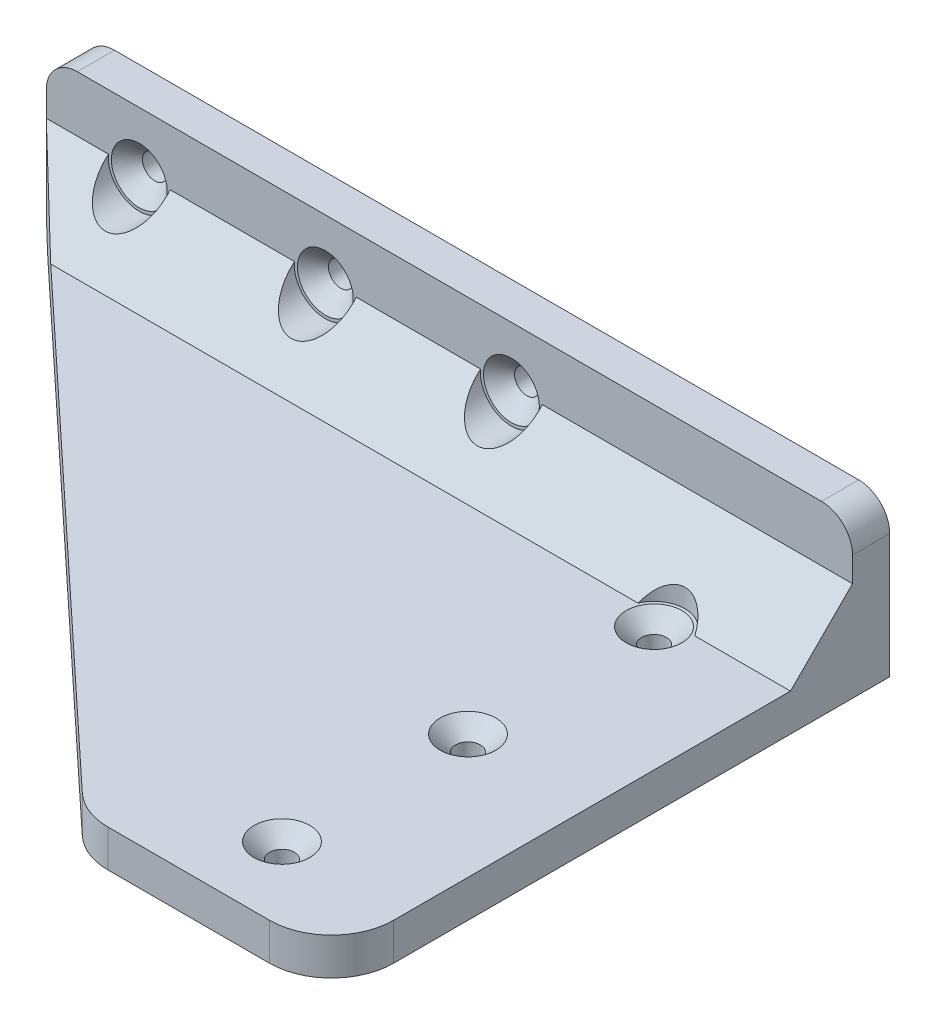
ISO-10303-21;
HEADER;
FILE_DESCRIPTION(('STEP AP214'),'2;1');
FILE_NAME('part.step','',(''),(''),'','','');
FILE_SCHEMA(('AUTOMOTIVE_DESIGN { 1 0 10303 214 1 1 1 1 }'));
ENDSEC;
DATA;
#1=APPLICATION_CONTEXT('core data for automotive mechanical design processes');
#2=APPLICATION_PROTOCOL_DEFINITION('international standard','automotive_design',2000,#1);
#3=PRODUCT_CONTEXT('',#1,'mechanical');
#4=PRODUCT('Part','Part','',(#3));
#5=PRODUCT_RELATED_PRODUCT_CATEGORY('part','',(#4));
#6=PRODUCT_DEFINITION_FORMATION('','',#4);
#7=PRODUCT_DEFINITION_CONTEXT('part definition',#1,'design');
#8=PRODUCT_DEFINITION('design','',#6,#7);
#9=PRODUCT_DEFINITION_SHAPE('','',#8);
#10=(LENGTH_UNIT() NAMED_UNIT(*) SI_UNIT(.MILLI.,.METRE.));
#11=(NAMED_UNIT(*) PLANE_ANGLE_UNIT() SI_UNIT($,.RADIAN.));
#12=(NAMED_UNIT(*) SI_UNIT($,.STERADIAN.) SOLID_ANGLE_UNIT());
#13=UNCERTAINTY_MEASURE_WITH_UNIT(LENGTH_MEASURE(1.E-05),#10,'distance_accuracy_value','');
#14=(GEOMETRIC_REPRESENTATION_CONTEXT(3) GLOBAL_UNCERTAINTY_ASSIGNED_CONTEXT((#13)) GLOBAL_UNIT_ASSIGNED_CONTEXT((#10,
#11,#12)) REPRESENTATION_CONTEXT('',''));
#15=CARTESIAN_POINT('',(0.,0.,0.));
#16=DIRECTION('',(0.,0.,1.));
#17=DIRECTION('',(1.,0.,0.));
#18=AXIS2_PLACEMENT_3D('',#15,#16,#17);
#19=CARTESIAN_POINT('',(0.,16.,6.));
#20=DIRECTION('',(0.,0.707106781186544,0.707106781186551));
#21=DIRECTION('',(-1.,0.,0.));
#22=AXIS2_PLACEMENT_3D('',#19,#20,#21);
#23=PLANE('',#22);
#24=CARTESIAN_POINT('',(110.,3.99999999999992,18.));
#25=DIRECTION('',(0.,0.707106781186544,0.707106781186551));
#26=DIRECTION('',(0.,-0.707106781186551,0.707106781186544));
#27=AXIS2_PLACEMENT_3D('',#24,#25,#26);
#28=ELLIPSE('',#27,7.07106781186552,5.);
#29=CARTESIAN_POINT('',(114.582575694956,6.,15.9999999999999));
#30=VERTEX_POINT('',#29);
#31=CARTESIAN_POINT('',(105.417424305044,6.,15.9999999999999));
#32=VERTEX_POINT('',#31);
#33=EDGE_CURVE('E152',#30,#32,#28,.T.);
#34=ORIENTED_EDGE('',*,*,#33,.F.);
#35=DIRECTION('',(-1.,0.,0.));
#36=VECTOR('',#35,1.);
#37=CARTESIAN_POINT('',(0.,6.,15.9999999999999));
#38=LINE('',#37,#36);
#39=CARTESIAN_POINT('',(130.,6.,16.));
#40=VERTEX_POINT('',#39);
#41=EDGE_CURVE('E161',#40,#30,#38,.T.);
#42=ORIENTED_EDGE('',*,*,#41,.F.);
#43=DIRECTION('',(0.,0.707106781186551,-0.707106781186544));
#44=VECTOR('',#43,1.);
#45=CARTESIAN_POINT('',(130.,10.9999999999999,11.));
#46=LINE('',#45,#44);
#47=CARTESIAN_POINT('',(130.,16.,6.));
#48=VERTEX_POINT('',#47);
#49=EDGE_CURVE('E171',#48,#40,#46,.F.);
#50=ORIENTED_EDGE('',*,*,#49,.F.);
#51=DIRECTION('',(1.,0.,0.));
#52=VECTOR('',#51,1.);
#53=CARTESIAN_POINT('',(130.,16.,6.));
#54=LINE('',#53,#52);
#55=CARTESIAN_POINT('',(79.9749371855331,16.,6.));
#56=VERTEX_POINT('',#55);
#57=EDGE_CURVE('E287',#56,#48,#54,.T.);
#58=ORIENTED_EDGE('',*,*,#57,.F.);
#59=CARTESIAN_POINT('',(75.,15.5,6.50000000000003));
#60=DIRECTION('',(0.,0.707106781186544,0.707106781186551));
#61=DIRECTION('',(0.,0.707106781186551,-0.707106781186544));
#62=AXIS2_PLACEMENT_3D('',#59,#60,#61);
#63=ELLIPSE('',#62,7.07106781186545,5.);
#64=CARTESIAN_POINT('',(70.0250628144669,16.,6.));
#65=VERTEX_POINT('',#64);
#66=EDGE_CURVE('E303',#65,#56,#63,.T.);
#67=ORIENTED_EDGE('',*,*,#66,.F.);
#68=DIRECTION('',(1.,0.,0.));
#69=VECTOR('',#68,1.);
#70=CARTESIAN_POINT('',(130.,16.,6.));
#71=LINE('',#70,#69);
#72=CARTESIAN_POINT('',(49.9749371855331,16.,6.));
#73=VERTEX_POINT('',#72);
#74=EDGE_CURVE('E290',#73,#65,#71,.T.);
#75=ORIENTED_EDGE('',*,*,#74,.F.);
#76=CARTESIAN_POINT('',(45.,15.5,6.50000000000003));
#77=DIRECTION('',(0.,0.707106781186544,0.707106781186551));
#78=DIRECTION('',(0.,0.707106781186551,-0.707106781186544));
#79=AXIS2_PLACEMENT_3D('',#76,#77,#78);
#80=ELLIPSE('',#79,7.07106781186544,5.);
#81=CARTESIAN_POINT('',(40.0250628144669,16.,6.));
#82=VERTEX_POINT('',#81);
#83=EDGE_CURVE('E181',#82,#73,#80,.T.);
#84=ORIENTED_EDGE('',*,*,#83,.F.);
#85=DIRECTION('',(1.,0.,0.));
#86=VECTOR('',#85,1.);
#87=CARTESIAN_POINT('',(130.,16.,6.));
#88=LINE('',#87,#86);
#89=CARTESIAN_POINT('',(19.9749371855331,16.,6.));
#90=VERTEX_POINT('',#89);
#91=EDGE_CURVE('E293',#90,#82,#88,.T.);
#92=ORIENTED_EDGE('',*,*,#91,.F.);
#93=CARTESIAN_POINT('',(15.,15.5,6.50000000000003));
#94=DIRECTION('',(0.,0.707106781186544,0.707106781186551));
#95=DIRECTION('',(0.,0.707106781186551,-0.707106781186544));
#96=AXIS2_PLACEMENT_3D('',#93,#94,#95);
#97=ELLIPSE('',#96,7.07106781186544,5.);
#98=CARTESIAN_POINT('',(10.0250628144669,16.,6.));
#99=VERTEX_POINT('',#98);
#100=EDGE_CURVE('E299',#99,#90,#97,.T.);
#101=ORIENTED_EDGE('',*,*,#100,.F.);
#102=DIRECTION('',(1.,0.,0.));
#103=VECTOR('',#102,1.);
#104=CARTESIAN_POINT('',(130.,16.,6.));
#105=LINE('',#104,#103);
#106=CARTESIAN_POINT('',(0.,16.,6.));
#107=VERTEX_POINT('',#106);
#108=EDGE_CURVE('E175',#107,#99,#105,.T.);
#109=ORIENTED_EDGE('',*,*,#108,.F.);
#110=DIRECTION('',(0.603877261671354,-0.563618777559936,0.56361877755993));
#111=VECTOR('',#110,1.);
#112=CARTESIAN_POINT('',(0.,16.,6.));
#113=LINE('',#112,#111);
#114=CARTESIAN_POINT('',(10.7142857142856,6.,15.9999999999999));
#115=VERTEX_POINT('',#114);
#116=EDGE_CURVE('E173',#115,#107,#113,.F.);
#117=ORIENTED_EDGE('',*,*,#116,.F.);
#118=DIRECTION('',(-1.,0.,0.));
#119=VECTOR('',#118,1.);
#120=CARTESIAN_POINT('',(0.,6.,15.9999999999999));
#121=LINE('',#120,#119);
#122=EDGE_CURVE('E163',#32,#115,#121,.T.);
#123=ORIENTED_EDGE('',*,*,#122,.F.);
#124=EDGE_LOOP('',(#34,#42,#50,#58,#67,#75,#84,#92,#101,#109,#117,#123));
#125=FACE_BOUND('',#124,.T.);
#126=ADVANCED_FACE('F32',(#125),#23,.T.);
#127=CARTESIAN_POINT('',(75.,15.5,0.));
#128=DIRECTION('',(0.,0.,1.));
#129=DIRECTION('',(1.,0.,0.));
#130=AXIS2_PLACEMENT_3D('',#127,#128,#129);
#131=CYLINDRICAL_SURFACE('',#130,2.);
#132=CARTESIAN_POINT('',(75.,15.5,3.49999999999994));
#133=DIRECTION('',(0.,0.,-1.));
#134=DIRECTION('',(-1.,0.,0.));
#135=AXIS2_PLACEMENT_3D('',#132,#133,#134);
#136=CIRCLE('',#135,2.);
#137=CARTESIAN_POINT('',(73.,15.5,3.49999999999994));
#138=VERTEX_POINT('',#137);
#139=EDGE_CURVE('E201',#138,#138,#136,.F.);
#140=ORIENTED_EDGE('',*,*,#139,.T.);
#141=EDGE_LOOP('',(#140));
#142=FACE_BOUND('',#141,.T.);
#143=CARTESIAN_POINT('',(75.,15.5,0.));
#144=DIRECTION('',(0.,0.,1.));
#145=DIRECTION('',(-1.,0.,0.));
#146=AXIS2_PLACEMENT_3D('',#143,#144,#145);
#147=CIRCLE('',#146,2.);
#148=CARTESIAN_POINT('',(73.,15.5,0.));
#149=VERTEX_POINT('',#148);
#150=EDGE_CURVE('E319',#149,#149,#147,.T.);
#151=ORIENTED_EDGE('',*,*,#150,.F.);
#152=EDGE_LOOP('',(#151));
#153=FACE_BOUND('',#152,.T.);
#154=ADVANCED_FACE('F383',(#142,#153),#131,.F.);
#155=CARTESIAN_POINT('',(15.,15.5,0.));
#156=DIRECTION('',(0.,0.,1.));
#157=DIRECTION('',(1.,0.,0.));
#158=AXIS2_PLACEMENT_3D('',#155,#156,#157);
#159=CYLINDRICAL_SURFACE('',#158,2.);
#160=CARTESIAN_POINT('',(15.,15.5,3.49999999999998));
#161=DIRECTION('',(0.,0.,-1.));
#162=DIRECTION('',(-1.,0.,0.));
#163=AXIS2_PLACEMENT_3D('',#160,#161,#162);
#164=CIRCLE('',#163,2.);
#165=CARTESIAN_POINT('',(13.,15.5,3.49999999999998));
#166=VERTEX_POINT('',#165);
#167=EDGE_CURVE('E216',#166,#166,#164,.F.);
#168=ORIENTED_EDGE('',*,*,#167,.T.);
#169=EDGE_LOOP('',(#168));
#170=FACE_BOUND('',#169,.T.);
#171=CARTESIAN_POINT('',(15.,15.5,0.));
#172=DIRECTION('',(0.,0.,1.));
#173=DIRECTION('',(1.,0.,0.));
#174=AXIS2_PLACEMENT_3D('',#171,#172,#173);
#175=CIRCLE('',#174,2.);
#176=CARTESIAN_POINT('',(17.,15.5,0.));
#177=VERTEX_POINT('',#176);
#178=EDGE_CURVE('E320',#177,#177,#175,.T.);
#179=ORIENTED_EDGE('',*,*,#178,.F.);
#180=EDGE_LOOP('',(#179));
#181=FACE_BOUND('',#180,.T.);
#182=ADVANCED_FACE('F388',(#170,#181),#159,.F.);
#183=CARTESIAN_POINT('',(45.,15.5,0.));
#184=DIRECTION('',(0.,0.,1.));
#185=DIRECTION('',(1.,0.,0.));
#186=AXIS2_PLACEMENT_3D('',#183,#184,#185);
#187=CYLINDRICAL_SURFACE('',#186,2.);
#188=CARTESIAN_POINT('',(45.,15.5,3.49999999999998));
#189=DIRECTION('',(0.,0.,-1.));
#190=DIRECTION('',(-1.,0.,0.));
#191=AXIS2_PLACEMENT_3D('',#188,#189,#190);
#192=CIRCLE('',#191,2.);
#193=CARTESIAN_POINT('',(43.,15.5,3.49999999999998));
#194=VERTEX_POINT('',#193);
#195=EDGE_CURVE('E213',#194,#194,#192,.F.);
#196=ORIENTED_EDGE('',*,*,#195,.T.);
#197=EDGE_LOOP('',(#196));
#198=FACE_BOUND('',#197,.T.);
#199=CARTESIAN_POINT('',(45.,15.5,0.));
#200=DIRECTION('',(0.,0.,1.));
#201=DIRECTION('',(1.,0.,0.));
#202=AXIS2_PLACEMENT_3D('',#199,#200,#201);
#203=CIRCLE('',#202,2.);
#204=CARTESIAN_POINT('',(47.,15.5,0.));
#205=VERTEX_POINT('',#204);
#206=EDGE_CURVE('E323',#205,#205,#203,.T.);
#207=ORIENTED_EDGE('',*,*,#206,.F.);
#208=EDGE_LOOP('',(#207));
#209=FACE_BOUND('',#208,.T.);
#210=ADVANCED_FACE('F542',(#198,#209),#187,.F.);
#211=CARTESIAN_POINT('',(0.,0.,6.));
#212=DIRECTION('',(0.,0.,-1.));
#213=DIRECTION('',(-1.,0.,0.));
#214=AXIS2_PLACEMENT_3D('',#211,#212,#213);
#215=PLANE('',#214);
#216=CARTESIAN_POINT('',(75.,15.5,6.));
#217=DIRECTION('',(0.,0.,-1.));
#218=DIRECTION('',(-1.,0.,0.));
#219=AXIS2_PLACEMENT_3D('',#216,#217,#218);
#220=CIRCLE('',#219,4.50000000000007);
#221=CARTESIAN_POINT('',(70.4999999999999,15.5,6.));
#222=VERTEX_POINT('',#221);
#223=EDGE_CURVE('E210',#222,#222,#220,.T.);
#224=ORIENTED_EDGE('',*,*,#223,.T.);
#225=EDGE_LOOP('',(#224));
#226=FACE_BOUND('',#225,.T.);
#227=CARTESIAN_POINT('',(45.,15.5,6.));
#228=DIRECTION('',(0.,0.,-1.));
#229=DIRECTION('',(-1.,0.,0.));
#230=AXIS2_PLACEMENT_3D('',#227,#228,#229);
#231=CIRCLE('',#230,4.50000000000003);
#232=CARTESIAN_POINT('',(40.5,15.5,6.));
#233=VERTEX_POINT('',#232);
#234=EDGE_CURVE('E207',#233,#233,#231,.T.);
#235=ORIENTED_EDGE('',*,*,#234,.T.);
#236=EDGE_LOOP('',(#235));
#237=FACE_BOUND('',#236,.T.);
#238=CARTESIAN_POINT('',(15.,15.5,6.));
#239=DIRECTION('',(0.,0.,-1.));
#240=DIRECTION('',(-1.,0.,0.));
#241=AXIS2_PLACEMENT_3D('',#238,#239,#240);
#242=CIRCLE('',#241,4.50000000000003);
#243=CARTESIAN_POINT('',(10.5,15.5,6.));
#244=VERTEX_POINT('',#243);
#245=EDGE_CURVE('E204',#244,#244,#242,.T.);
#246=ORIENTED_EDGE('',*,*,#245,.T.);
#247=EDGE_LOOP('',(#246));
#248=FACE_BOUND('',#247,.T.);
#249=DIRECTION('',(-1.,0.,0.));
#250=VECTOR('',#249,1.);
#251=CARTESIAN_POINT('',(0.,25.,6.));
#252=LINE('',#251,#250);
#253=CARTESIAN_POINT('',(125.,25.,6.));
#254=VERTEX_POINT('',#253);
#255=CARTESIAN_POINT('',(5.,25.,6.));
#256=VERTEX_POINT('',#255);
#257=EDGE_CURVE('E263',#254,#256,#252,.T.);
#258=ORIENTED_EDGE('',*,*,#257,.T.);
#259=CARTESIAN_POINT('',(5.,20.,6.));
#260=DIRECTION('',(0.,0.,-1.));
#261=DIRECTION('',(-1.,0.,0.));
#262=AXIS2_PLACEMENT_3D('',#259,#260,#261);
#263=CIRCLE('',#262,5.);
#264=CARTESIAN_POINT('',(0.,20.,6.));
#265=VERTEX_POINT('',#264);
#266=EDGE_CURVE('E40',#256,#265,#263,.F.);
#267=ORIENTED_EDGE('',*,*,#266,.T.);
#268=DIRECTION('',(0.,-1.,0.));
#269=VECTOR('',#268,1.);
#270=CARTESIAN_POINT('',(0.,0.,6.));
#271=LINE('',#270,#269);
#272=EDGE_CURVE('E261',#265,#107,#271,.T.);
#273=ORIENTED_EDGE('',*,*,#272,.T.);
#274=ORIENTED_EDGE('',*,*,#108,.T.);
#275=CARTESIAN_POINT('',(15.,15.5,6.));
#276=DIRECTION('',(0.,0.,1.));
#277=DIRECTION('',(1.,0.,0.));
#278=AXIS2_PLACEMENT_3D('',#275,#276,#277);
#279=CIRCLE('',#278,5.);
#280=EDGE_CURVE('E296',#99,#90,#279,.T.);
#281=ORIENTED_EDGE('',*,*,#280,.T.);
#282=ORIENTED_EDGE('',*,*,#91,.T.);
#283=CARTESIAN_POINT('',(45.,15.5,6.));
#284=DIRECTION('',(0.,0.,1.));
#285=DIRECTION('',(1.,0.,0.));
#286=AXIS2_PLACEMENT_3D('',#283,#284,#285);
#287=CIRCLE('',#286,5.);
#288=EDGE_CURVE('E302',#82,#73,#287,.T.);
#289=ORIENTED_EDGE('',*,*,#288,.T.);
#290=ORIENTED_EDGE('',*,*,#74,.T.);
#291=CARTESIAN_POINT('',(75.,15.5,6.));
#292=DIRECTION('',(0.,0.,1.));
#293=DIRECTION('',(1.,0.,0.));
#294=AXIS2_PLACEMENT_3D('',#291,#292,#293);
#295=CIRCLE('',#294,5.);
#296=EDGE_CURVE('E164',#65,#56,#295,.T.);
#297=ORIENTED_EDGE('',*,*,#296,.T.);
#298=ORIENTED_EDGE('',*,*,#57,.T.);
#299=DIRECTION('',(0.,-1.,0.));
#300=VECTOR('',#299,1.);
#301=CARTESIAN_POINT('',(130.,65.4474968323134,6.));
#302=LINE('',#301,#300);
#303=CARTESIAN_POINT('',(130.,20.,6.));
#304=VERTEX_POINT('',#303);
#305=EDGE_CURVE('E334',#304,#48,#302,.T.);
#306=ORIENTED_EDGE('',*,*,#305,.F.);
#307=CARTESIAN_POINT('',(125.,20.,6.));
#308=DIRECTION('',(0.,0.,-1.));
#309=DIRECTION('',(-1.,0.,0.));
#310=AXIS2_PLACEMENT_3D('',#307,#308,#309);
#311=CIRCLE('',#310,5.);
#312=EDGE_CURVE('E47',#304,#254,#311,.F.);
#313=ORIENTED_EDGE('',*,*,#312,.T.);
#314=EDGE_LOOP('',(#258,#267,#273,#274,#281,#282,#289,#290,#297,#298,#306,#313));
#315=FACE_BOUND('',#314,.T.);
#316=ADVANCED_FACE('F259',(#226,#237,#248,#315),#215,.F.);
#317=CARTESIAN_POINT('',(130.,6.,90.));
#318=DIRECTION('',(0.,-1.,0.));
#319=DIRECTION('',(0.,0.,-1.));
#320=AXIS2_PLACEMENT_3D('',#317,#318,#319);
#321=PLANE('',#320);
#322=CARTESIAN_POINT('',(110.,6.,78.));
#323=DIRECTION('',(0.,-1.,0.));
#324=DIRECTION('',(0.,0.,-1.));
#325=AXIS2_PLACEMENT_3D('',#322,#323,#324);
#326=CIRCLE('',#325,4.49999999999999);
#327=CARTESIAN_POINT('',(110.,6.,73.5));
#328=VERTEX_POINT('',#327);
#329=EDGE_CURVE('E189',#328,#328,#326,.T.);
#330=ORIENTED_EDGE('',*,*,#329,.T.);
#331=EDGE_LOOP('',(#330));
#332=FACE_BOUND('',#331,.T.);
#333=CARTESIAN_POINT('',(110.,6.,48.));
#334=DIRECTION('',(0.,-1.,0.));
#335=DIRECTION('',(0.,0.,-1.));
#336=AXIS2_PLACEMENT_3D('',#333,#334,#335);
#337=CIRCLE('',#336,4.49999999999995);
#338=CARTESIAN_POINT('',(110.,6.,52.5));
#339=VERTEX_POINT('',#338);
#340=EDGE_CURVE('E186',#339,#339,#337,.T.);
#341=ORIENTED_EDGE('',*,*,#340,.T.);
#342=EDGE_LOOP('',(#341));
#343=FACE_BOUND('',#342,.T.);
#344=CARTESIAN_POINT('',(110.,6.,18.));
#345=DIRECTION('',(0.,-1.,0.));
#346=DIRECTION('',(0.,0.,-1.));
#347=AXIS2_PLACEMENT_3D('',#344,#345,#346);
#348=CIRCLE('',#347,4.49999999999996);
#349=CARTESIAN_POINT('',(110.,6.,13.5));
#350=VERTEX_POINT('',#349);
#351=EDGE_CURVE('E183',#350,#350,#348,.T.);
#352=ORIENTED_EDGE('',*,*,#351,.T.);
#353=EDGE_LOOP('',(#352));
#354=FACE_BOUND('',#353,.T.);
#355=DIRECTION('',(-1.,0.,0.));
#356=VECTOR('',#355,1.);
#357=CARTESIAN_POINT('',(130.,6.,90.));
#358=LINE('',#357,#356);
#359=CARTESIAN_POINT('',(120.,6.,90.));
#360=VERTEX_POINT('',#359);
#361=CARTESIAN_POINT('',(93.9416318062023,6.,90.));
#362=VERTEX_POINT('',#361);
#363=EDGE_CURVE('E346',#360,#362,#358,.T.);
#364=ORIENTED_EDGE('',*,*,#363,.F.);
#365=CARTESIAN_POINT('',(120.,6.,80.));
#366=DIRECTION('',(0.,-1.,0.));
#367=DIRECTION('',(0.,0.,-1.));
#368=AXIS2_PLACEMENT_3D('',#365,#366,#367);
#369=CIRCLE('',#368,10.);
#370=CARTESIAN_POINT('',(130.,6.,80.));
#371=VERTEX_POINT('',#370);
#372=EDGE_CURVE('E233',#360,#371,#369,.F.);
#373=ORIENTED_EDGE('',*,*,#372,.T.);
#374=DIRECTION('',(0.,0.,1.));
#375=VECTOR('',#374,1.);
#376=CARTESIAN_POINT('',(130.,6.,90.));
#377=LINE('',#376,#375);
#378=EDGE_CURVE('E170',#40,#371,#377,.T.);
#379=ORIENTED_EDGE('',*,*,#378,.F.);
#380=ORIENTED_EDGE('',*,*,#41,.T.);
#381=CARTESIAN_POINT('',(110.,6.,18.));
#382=DIRECTION('',(0.,1.,0.));
#383=DIRECTION('',(0.,0.,1.));
#384=AXIS2_PLACEMENT_3D('',#381,#382,#383);
#385=CIRCLE('',#384,5.);
#386=EDGE_CURVE('E149',#30,#32,#385,.T.);
#387=ORIENTED_EDGE('',*,*,#386,.T.);
#388=ORIENTED_EDGE('',*,*,#122,.T.);
#389=DIRECTION('',(-0.731055268242869,0.,-0.682318250360011));
#390=VECTOR('',#389,1.);
#391=CARTESIAN_POINT('',(0.,6.,6.));
#392=LINE('',#391,#390);
#393=CARTESIAN_POINT('',(87.1184493026022,6.,87.3105526824287));
#394=VERTEX_POINT('',#393);
#395=EDGE_CURVE('E329',#394,#115,#392,.T.);
#396=ORIENTED_EDGE('',*,*,#395,.F.);
#397=CARTESIAN_POINT('',(93.9416318062023,6.,80.));
#398=DIRECTION('',(0.,-1.,0.));
#399=DIRECTION('',(0.,0.,-1.));
#400=AXIS2_PLACEMENT_3D('',#397,#398,#399);
#401=CIRCLE('',#400,10.);
#402=EDGE_CURVE('E231',#394,#362,#401,.F.);
#403=ORIENTED_EDGE('',*,*,#402,.T.);
#404=EDGE_LOOP('',(#364,#373,#379,#380,#387,#388,#396,#403));
#405=FACE_BOUND('',#404,.T.);
#406=ADVANCED_FACE('F168',(#332,#343,#354,#405),#321,.F.);
#407=CARTESIAN_POINT('',(0.,0.,6.));
#408=DIRECTION('',(1.,0.,0.));
#409=DIRECTION('',(0.,0.,-1.));
#410=AXIS2_PLACEMENT_3D('',#407,#408,#409);
#411=PLANE('',#410);
#412=DIRECTION('',(0.,-1.,0.));
#413=VECTOR('',#412,1.);
#414=CARTESIAN_POINT('',(0.,0.,0.));
#415=LINE('',#414,#413);
#416=CARTESIAN_POINT('',(0.,20.,0.));
#417=VERTEX_POINT('',#416);
#418=CARTESIAN_POINT('',(0.,5.,0.));
#419=VERTEX_POINT('',#418);
#420=EDGE_CURVE('E280',#417,#419,#415,.T.);
#421=ORIENTED_EDGE('',*,*,#420,.T.);
#422=DIRECTION('',(0.,0.,-1.));
#423=VECTOR('',#422,1.);
#424=CARTESIAN_POINT('',(0.,5.,6.));
#425=LINE('',#424,#423);
#426=CARTESIAN_POINT('',(0.,5.,6.));
#427=VERTEX_POINT('',#426);
#428=EDGE_CURVE('E249',#419,#427,#425,.F.);
#429=ORIENTED_EDGE('',*,*,#428,.T.);
#430=DIRECTION('',(0.,-1.,0.));
#431=VECTOR('',#430,1.);
#432=CARTESIAN_POINT('',(0.,6.,6.));
#433=LINE('',#432,#431);
#434=EDGE_CURVE('E271',#107,#427,#433,.T.);
#435=ORIENTED_EDGE('',*,*,#434,.F.);
#436=ORIENTED_EDGE('',*,*,#272,.F.);
#437=DIRECTION('',(0.,0.,-1.));
#438=VECTOR('',#437,1.);
#439=CARTESIAN_POINT('',(0.,20.,6.));
#440=LINE('',#439,#438);
#441=EDGE_CURVE('E246',#265,#417,#440,.T.);
#442=ORIENTED_EDGE('',*,*,#441,.T.);
#443=EDGE_LOOP('',(#421,#429,#435,#436,#442));
#444=FACE_BOUND('',#443,.T.);
#445=ADVANCED_FACE('F268',(#444),#411,.F.);
#446=CARTESIAN_POINT('',(0.,0.,6.));
#447=DIRECTION('',(0.,1.,0.));
#448=DIRECTION('',(0.,0.,1.));
#449=AXIS2_PLACEMENT_3D('',#446,#447,#448);
#450=PLANE('',#449);
#451=CARTESIAN_POINT('',(110.,0.,18.));
#452=DIRECTION('',(0.,1.,0.));
#453=DIRECTION('',(0.,0.,1.));
#454=AXIS2_PLACEMENT_3D('',#451,#452,#453);
#455=CIRCLE('',#454,2.);
#456=CARTESIAN_POINT('',(110.,0.,20.));
#457=VERTEX_POINT('',#456);
#458=EDGE_CURVE('E311',#457,#457,#455,.T.);
#459=ORIENTED_EDGE('',*,*,#458,.T.);
#460=EDGE_LOOP('',(#459));
#461=FACE_BOUND('',#460,.T.);
#462=CARTESIAN_POINT('',(110.,0.,78.));
#463=DIRECTION('',(0.,1.,0.));
#464=DIRECTION('',(0.,0.,-1.));
#465=AXIS2_PLACEMENT_3D('',#462,#463,#464);
#466=CIRCLE('',#465,2.);
#467=CARTESIAN_POINT('',(110.,0.,76.));
#468=VERTEX_POINT('',#467);
#469=EDGE_CURVE('E306',#468,#468,#466,.T.);
#470=ORIENTED_EDGE('',*,*,#469,.T.);
#471=EDGE_LOOP('',(#470));
#472=FACE_BOUND('',#471,.T.);
#473=CARTESIAN_POINT('',(110.,0.,48.));
#474=DIRECTION('',(0.,1.,0.));
#475=DIRECTION('',(0.,0.,1.));
#476=AXIS2_PLACEMENT_3D('',#473,#474,#475);
#477=CIRCLE('',#476,2.);
#478=CARTESIAN_POINT('',(110.,0.,50.));
#479=VERTEX_POINT('',#478);
#480=EDGE_CURVE('E314',#479,#479,#477,.T.);
#481=ORIENTED_EDGE('',*,*,#480,.T.);
#482=EDGE_LOOP('',(#481));
#483=FACE_BOUND('',#482,.T.);
#484=DIRECTION('',(-0.731055268242869,0.,-0.682318250360011));
#485=VECTOR('',#484,1.);
#486=CARTESIAN_POINT('',(0.,0.,6.));
#487=LINE('',#486,#485);
#488=CARTESIAN_POINT('',(87.1184493026022,0.,87.3105526824287));
#489=VERTEX_POINT('',#488);
#490=CARTESIAN_POINT('',(5.,0.,10.6666666666667));
#491=VERTEX_POINT('',#490);
#492=EDGE_CURVE('E328',#489,#491,#487,.T.);
#493=ORIENTED_EDGE('',*,*,#492,.T.);
#494=DIRECTION('',(0.,0.,-1.));
#495=VECTOR('',#494,1.);
#496=CARTESIAN_POINT('',(5.,0.,6.));
#497=LINE('',#496,#495);
#498=CARTESIAN_POINT('',(5.,0.,0.));
#499=VERTEX_POINT('',#498);
#500=EDGE_CURVE('E237',#491,#499,#497,.T.);
#501=ORIENTED_EDGE('',*,*,#500,.T.);
#502=DIRECTION('',(1.,0.,0.));
#503=VECTOR('',#502,1.);
#504=CARTESIAN_POINT('',(0.,0.,0.));
#505=LINE('',#504,#503);
#506=CARTESIAN_POINT('',(130.,0.,0.));
#507=VERTEX_POINT('',#506);
#508=EDGE_CURVE('E282',#499,#507,#505,.T.);
#509=ORIENTED_EDGE('',*,*,#508,.T.);
#510=DIRECTION('',(0.,0.,-1.));
#511=VECTOR('',#510,1.);
#512=CARTESIAN_POINT('',(130.,0.,0.));
#513=LINE('',#512,#511);
#514=CARTESIAN_POINT('',(130.,0.,80.));
#515=VERTEX_POINT('',#514);
#516=EDGE_CURVE('E340',#515,#507,#513,.T.);
#517=ORIENTED_EDGE('',*,*,#516,.F.);
#518=CARTESIAN_POINT('',(120.,0.,80.));
#519=DIRECTION('',(0.,1.,0.));
#520=DIRECTION('',(0.,0.,1.));
#521=AXIS2_PLACEMENT_3D('',#518,#519,#520);
#522=CIRCLE('',#521,10.);
#523=CARTESIAN_POINT('',(120.,0.,90.));
#524=VERTEX_POINT('',#523);
#525=EDGE_CURVE('E224',#515,#524,#522,.F.);
#526=ORIENTED_EDGE('',*,*,#525,.T.);
#527=DIRECTION('',(-1.,0.,0.));
#528=VECTOR('',#527,1.);
#529=CARTESIAN_POINT('',(130.,0.,90.));
#530=LINE('',#529,#528);
#531=CARTESIAN_POINT('',(93.9416318062023,0.,90.));
#532=VERTEX_POINT('',#531);
#533=EDGE_CURVE('E343',#524,#532,#530,.T.);
#534=ORIENTED_EDGE('',*,*,#533,.T.);
#535=CARTESIAN_POINT('',(93.9416318062023,0.,80.));
#536=DIRECTION('',(0.,1.,0.));
#537=DIRECTION('',(0.,0.,1.));
#538=AXIS2_PLACEMENT_3D('',#535,#536,#537);
#539=CIRCLE('',#538,10.);
#540=EDGE_CURVE('E222',#532,#489,#539,.F.);
#541=ORIENTED_EDGE('',*,*,#540,.T.);
#542=EDGE_LOOP('',(#493,#501,#509,#517,#526,#534,#541));
#543=FACE_BOUND('',#542,.T.);
#544=ADVANCED_FACE('F359',(#461,#472,#483,#543),#450,.F.);
#545=CARTESIAN_POINT('',(0.,25.,6.));
#546=DIRECTION('',(0.,-1.,0.));
#547=DIRECTION('',(0.,0.,-1.));
#548=AXIS2_PLACEMENT_3D('',#545,#546,#547);
#549=PLANE('',#548);
#550=DIRECTION('',(-1.,0.,0.));
#551=VECTOR('',#550,1.);
#552=CARTESIAN_POINT('',(0.,25.,0.));
#553=LINE('',#552,#551);
#554=CARTESIAN_POINT('',(125.,25.,0.));
#555=VERTEX_POINT('',#554);
#556=CARTESIAN_POINT('',(5.,25.,0.));
#557=VERTEX_POINT('',#556);
#558=EDGE_CURVE('E272',#555,#557,#553,.T.);
#559=ORIENTED_EDGE('',*,*,#558,.T.);
#560=DIRECTION('',(0.,0.,-1.));
#561=VECTOR('',#560,1.);
#562=CARTESIAN_POINT('',(5.,25.,6.));
#563=LINE('',#562,#561);
#564=EDGE_CURVE('E54',#557,#256,#563,.F.);
#565=ORIENTED_EDGE('',*,*,#564,.T.);
#566=ORIENTED_EDGE('',*,*,#257,.F.);
#567=DIRECTION('',(0.,0.,1.));
#568=VECTOR('',#567,1.);
#569=CARTESIAN_POINT('',(125.,25.,6.));
#570=LINE('',#569,#568);
#571=EDGE_CURVE('E253',#254,#555,#570,.F.);
#572=ORIENTED_EDGE('',*,*,#571,.T.);
#573=EDGE_LOOP('',(#559,#565,#566,#572));
#574=FACE_BOUND('',#573,.T.);
#575=ADVANCED_FACE('F281',(#574),#549,.F.);
#576=CARTESIAN_POINT('',(0.,0.,0.));
#577=DIRECTION('',(0.,0.,-1.));
#578=DIRECTION('',(-1.,0.,0.));
#579=AXIS2_PLACEMENT_3D('',#576,#577,#578);
#580=PLANE('',#579);
#581=ORIENTED_EDGE('',*,*,#178,.T.);
#582=EDGE_LOOP('',(#581));
#583=FACE_BOUND('',#582,.T.);
#584=ORIENTED_EDGE('',*,*,#150,.T.);
#585=EDGE_LOOP('',(#584));
#586=FACE_BOUND('',#585,.T.);
#587=ORIENTED_EDGE('',*,*,#206,.T.);
#588=EDGE_LOOP('',(#587));
#589=FACE_BOUND('',#588,.T.);
#590=ORIENTED_EDGE('',*,*,#508,.F.);
#591=CARTESIAN_POINT('',(5.,5.,0.));
#592=DIRECTION('',(0.,0.,-1.));
#593=DIRECTION('',(-1.,0.,0.));
#594=AXIS2_PLACEMENT_3D('',#591,#592,#593);
#595=CIRCLE('',#594,5.);
#596=EDGE_CURVE('E244',#499,#419,#595,.T.);
#597=ORIENTED_EDGE('',*,*,#596,.T.);
#598=ORIENTED_EDGE('',*,*,#420,.F.);
#599=CARTESIAN_POINT('',(5.,20.,0.));
#600=DIRECTION('',(0.,0.,-1.));
#601=DIRECTION('',(-1.,0.,0.));
#602=AXIS2_PLACEMENT_3D('',#599,#600,#601);
#603=CIRCLE('',#602,5.);
#604=EDGE_CURVE('E242',#417,#557,#603,.T.);
#605=ORIENTED_EDGE('',*,*,#604,.T.);
#606=ORIENTED_EDGE('',*,*,#558,.F.);
#607=CARTESIAN_POINT('',(125.,20.,0.));
#608=DIRECTION('',(0.,0.,-1.));
#609=DIRECTION('',(-1.,0.,0.));
#610=AXIS2_PLACEMENT_3D('',#607,#608,#609);
#611=CIRCLE('',#610,5.);
#612=CARTESIAN_POINT('',(130.,20.,0.));
#613=VERTEX_POINT('',#612);
#614=EDGE_CURVE('E240',#555,#613,#611,.T.);
#615=ORIENTED_EDGE('',*,*,#614,.T.);
#616=DIRECTION('',(0.,1.,0.));
#617=VECTOR('',#616,1.);
#618=CARTESIAN_POINT('',(130.,6.,0.));
#619=LINE('',#618,#617);
#620=EDGE_CURVE('E336',#507,#613,#619,.T.);
#621=ORIENTED_EDGE('',*,*,#620,.F.);
#622=EDGE_LOOP('',(#590,#597,#598,#605,#606,#615,#621));
#623=FACE_BOUND('',#622,.T.);
#624=ADVANCED_FACE('F278',(#583,#586,#589,#623),#580,.T.);
#625=CARTESIAN_POINT('',(130.,0.,90.));
#626=DIRECTION('',(0.,0.,-1.));
#627=DIRECTION('',(-1.,0.,0.));
#628=AXIS2_PLACEMENT_3D('',#625,#626,#627);
#629=PLANE('',#628);
#630=ORIENTED_EDGE('',*,*,#533,.F.);
#631=DIRECTION('',(0.,-1.,0.));
#632=VECTOR('',#631,1.);
#633=CARTESIAN_POINT('',(120.,0.,90.));
#634=LINE('',#633,#632);
#635=EDGE_CURVE('E229',#524,#360,#634,.F.);
#636=ORIENTED_EDGE('',*,*,#635,.T.);
#637=ORIENTED_EDGE('',*,*,#363,.T.);
#638=DIRECTION('',(0.,-1.,0.));
#639=VECTOR('',#638,1.);
#640=CARTESIAN_POINT('',(93.9416318062023,0.,90.));
#641=LINE('',#640,#639);
#642=EDGE_CURVE('E226',#362,#532,#641,.T.);
#643=ORIENTED_EDGE('',*,*,#642,.T.);
#644=EDGE_LOOP('',(#630,#636,#637,#643));
#645=FACE_BOUND('',#644,.T.);
#646=ADVANCED_FACE('F366',(#645),#629,.F.);
#647=CARTESIAN_POINT('',(130.,0.,0.));
#648=DIRECTION('',(-1.,0.,0.));
#649=DIRECTION('',(0.,0.,1.));
#650=AXIS2_PLACEMENT_3D('',#647,#648,#649);
#651=PLANE('',#650);
#652=ORIENTED_EDGE('',*,*,#620,.T.);
#653=DIRECTION('',(0.,0.,1.));
#654=VECTOR('',#653,1.);
#655=CARTESIAN_POINT('',(130.,20.,0.));
#656=LINE('',#655,#654);
#657=EDGE_CURVE('E11',#613,#304,#656,.T.);
#658=ORIENTED_EDGE('',*,*,#657,.T.);
#659=ORIENTED_EDGE('',*,*,#305,.T.);
#660=ORIENTED_EDGE('',*,*,#49,.T.);
#661=ORIENTED_EDGE('',*,*,#378,.T.);
#662=DIRECTION('',(0.,-1.,0.));
#663=VECTOR('',#662,1.);
#664=CARTESIAN_POINT('',(130.,0.,80.));
#665=LINE('',#664,#663);
#666=EDGE_CURVE('E219',#371,#515,#665,.T.);
#667=ORIENTED_EDGE('',*,*,#666,.T.);
#668=ORIENTED_EDGE('',*,*,#516,.T.);
#669=EDGE_LOOP('',(#652,#658,#659,#660,#661,#667,#668));
#670=FACE_BOUND('',#669,.T.);
#671=ADVANCED_FACE('F375',(#670),#651,.F.);
#672=CARTESIAN_POINT('',(0.,6.,6.));
#673=DIRECTION('',(-0.682318250360011,0.,0.731055268242869));
#674=DIRECTION('',(0.731055268242869,0.,0.682318250360011));
#675=AXIS2_PLACEMENT_3D('',#672,#673,#674);
#676=PLANE('',#675);
#677=ORIENTED_EDGE('',*,*,#434,.T.);
#678=CARTESIAN_POINT('',(5.,5.,10.6666666666667));
#679=DIRECTION('',(-0.682318250360011,0.,0.731055268242869));
#680=DIRECTION('',(-0.731055268242869,0.,-0.682318250360011));
#681=AXIS2_PLACEMENT_3D('',#678,#679,#680);
#682=ELLIPSE('',#681,6.83942817622773,5.);
#683=EDGE_CURVE('E251',#427,#491,#682,.T.);
#684=ORIENTED_EDGE('',*,*,#683,.T.);
#685=ORIENTED_EDGE('',*,*,#492,.F.);
#686=DIRECTION('',(0.,-1.,0.));
#687=VECTOR('',#686,1.);
#688=CARTESIAN_POINT('',(87.1184493026022,6.,87.3105526824287));
#689=LINE('',#688,#687);
#690=EDGE_CURVE('E235',#489,#394,#689,.F.);
#691=ORIENTED_EDGE('',*,*,#690,.T.);
#692=ORIENTED_EDGE('',*,*,#395,.T.);
#693=ORIENTED_EDGE('',*,*,#116,.T.);
#694=EDGE_LOOP('',(#677,#684,#685,#691,#692,#693));
#695=FACE_BOUND('',#694,.T.);
#696=ADVANCED_FACE('F356',(#695),#676,.T.);
#697=CARTESIAN_POINT('',(110.,0.,48.));
#698=DIRECTION('',(0.,1.,0.));
#699=DIRECTION('',(0.,0.,1.));
#700=AXIS2_PLACEMENT_3D('',#697,#698,#699);
#701=CYLINDRICAL_SURFACE('',#700,2.);
#702=CARTESIAN_POINT('',(110.,3.50000000000002,48.));
#703=DIRECTION('',(0.,-1.,0.));
#704=DIRECTION('',(0.,0.,-1.));
#705=AXIS2_PLACEMENT_3D('',#702,#703,#704);
#706=CIRCLE('',#705,2.);
#707=CARTESIAN_POINT('',(110.,3.50000000000002,50.));
#708=VERTEX_POINT('',#707);
#709=EDGE_CURVE('E195',#708,#708,#706,.F.);
#710=ORIENTED_EDGE('',*,*,#709,.T.);
#711=EDGE_LOOP('',(#710));
#712=FACE_BOUND('',#711,.T.);
#713=ORIENTED_EDGE('',*,*,#480,.F.);
#714=EDGE_LOOP('',(#713));
#715=FACE_BOUND('',#714,.T.);
#716=ADVANCED_FACE('F584',(#712,#715),#701,.F.);
#717=CARTESIAN_POINT('',(110.,0.,78.));
#718=DIRECTION('',(0.,1.,0.));
#719=DIRECTION('',(0.,0.,1.));
#720=AXIS2_PLACEMENT_3D('',#717,#718,#719);
#721=CYLINDRICAL_SURFACE('',#720,2.);
#722=CARTESIAN_POINT('',(110.,3.49999999999999,78.));
#723=DIRECTION('',(0.,-1.,0.));
#724=DIRECTION('',(0.,0.,-1.));
#725=AXIS2_PLACEMENT_3D('',#722,#723,#724);
#726=CIRCLE('',#725,2.);
#727=CARTESIAN_POINT('',(110.,3.49999999999999,76.));
#728=VERTEX_POINT('',#727);
#729=EDGE_CURVE('E192',#728,#728,#726,.F.);
#730=ORIENTED_EDGE('',*,*,#729,.T.);
#731=EDGE_LOOP('',(#730));
#732=FACE_BOUND('',#731,.T.);
#733=ORIENTED_EDGE('',*,*,#469,.F.);
#734=EDGE_LOOP('',(#733));
#735=FACE_BOUND('',#734,.T.);
#736=ADVANCED_FACE('F575',(#732,#735),#721,.F.);
#737=CARTESIAN_POINT('',(110.,0.,18.));
#738=DIRECTION('',(0.,1.,0.));
#739=DIRECTION('',(0.,0.,1.));
#740=AXIS2_PLACEMENT_3D('',#737,#738,#739);
#741=CYLINDRICAL_SURFACE('',#740,2.);
#742=CARTESIAN_POINT('',(110.,3.50000000000003,18.));
#743=DIRECTION('',(0.,-1.,0.));
#744=DIRECTION('',(0.,0.,-1.));
#745=AXIS2_PLACEMENT_3D('',#742,#743,#744);
#746=CIRCLE('',#745,2.);
#747=CARTESIAN_POINT('',(110.,3.50000000000003,16.));
#748=VERTEX_POINT('',#747);
#749=EDGE_CURVE('E198',#748,#748,#746,.F.);
#750=ORIENTED_EDGE('',*,*,#749,.T.);
#751=EDGE_LOOP('',(#750));
#752=FACE_BOUND('',#751,.T.);
#753=ORIENTED_EDGE('',*,*,#458,.F.);
#754=EDGE_LOOP('',(#753));
#755=FACE_BOUND('',#754,.T.);
#756=ADVANCED_FACE('F534',(#752,#755),#741,.F.);
#757=CARTESIAN_POINT('',(45.,15.5,90.));
#758=DIRECTION('',(0.,0.,-1.));
#759=DIRECTION('',(-1.,0.,0.));
#760=AXIS2_PLACEMENT_3D('',#757,#758,#759);
#761=CYLINDRICAL_SURFACE('',#760,5.);
#762=ORIENTED_EDGE('',*,*,#83,.T.);
#763=ORIENTED_EDGE('',*,*,#288,.F.);
#764=EDGE_LOOP('',(#762,#763));
#765=FACE_BOUND('',#764,.T.);
#766=ADVANCED_FACE('F526',(#765),#761,.F.);
#767=CARTESIAN_POINT('',(15.,15.5,90.));
#768=DIRECTION('',(0.,0.,-1.));
#769=DIRECTION('',(-1.,0.,0.));
#770=AXIS2_PLACEMENT_3D('',#767,#768,#769);
#771=CYLINDRICAL_SURFACE('',#770,5.);
#772=ORIENTED_EDGE('',*,*,#100,.T.);
#773=ORIENTED_EDGE('',*,*,#280,.F.);
#774=EDGE_LOOP('',(#772,#773));
#775=FACE_BOUND('',#774,.T.);
#776=ADVANCED_FACE('F517',(#775),#771,.F.);
#777=CARTESIAN_POINT('',(75.,15.5,90.));
#778=DIRECTION('',(0.,0.,-1.));
#779=DIRECTION('',(-1.,0.,0.));
#780=AXIS2_PLACEMENT_3D('',#777,#778,#779);
#781=CYLINDRICAL_SURFACE('',#780,5.);
#782=ORIENTED_EDGE('',*,*,#66,.T.);
#783=ORIENTED_EDGE('',*,*,#296,.F.);
#784=EDGE_LOOP('',(#782,#783));
#785=FACE_BOUND('',#784,.T.);
#786=ADVANCED_FACE('F491',(#785),#781,.F.);
#787=CARTESIAN_POINT('',(110.,25.,18.));
#788=DIRECTION('',(0.,-1.,0.));
#789=DIRECTION('',(0.,0.,-1.));
#790=AXIS2_PLACEMENT_3D('',#787,#788,#789);
#791=CYLINDRICAL_SURFACE('',#790,5.);
#792=ORIENTED_EDGE('',*,*,#33,.T.);
#793=ORIENTED_EDGE('',*,*,#386,.F.);
#794=EDGE_LOOP('',(#792,#793));
#795=FACE_BOUND('',#794,.T.);
#796=ADVANCED_FACE('F151',(#795),#791,.F.);
#797=CARTESIAN_POINT('',(110.,6.,78.));
#798=DIRECTION('',(0.,1.,0.));
#799=DIRECTION('',(0.,0.,1.));
#800=AXIS2_PLACEMENT_3D('',#797,#798,#799);
#801=CONICAL_SURFACE('',#800,4.49999999999999,0.785398163397446);
#802=ORIENTED_EDGE('',*,*,#729,.F.);
#803=EDGE_LOOP('',(#802));
#804=FACE_BOUND('',#803,.T.);
#805=ORIENTED_EDGE('',*,*,#329,.F.);
#806=EDGE_LOOP('',(#805));
#807=FACE_BOUND('',#806,.T.);
#808=ADVANCED_FACE('F394',(#804,#807),#801,.F.);
#809=CARTESIAN_POINT('',(110.,6.,48.));
#810=DIRECTION('',(0.,1.,0.));
#811=DIRECTION('',(0.,0.,1.));
#812=AXIS2_PLACEMENT_3D('',#809,#810,#811);
#813=CONICAL_SURFACE('',#812,4.49999999999995,0.785398163397444);
#814=CARTESIAN_POINT('',(110.,3.50000000000002,50.));
#815=CARTESIAN_POINT('',(110.,3.52604166666669,50.0260416666667));
#816=CARTESIAN_POINT('',(110.,3.55208333333336,50.0520833333333));
#817=CARTESIAN_POINT('',(110.,3.60416666666669,50.1041666666667));
#818=CARTESIAN_POINT('',(110.,3.63020833333336,50.1302083333333));
#819=CARTESIAN_POINT('',(110.,3.68229166666669,50.1822916666667));
#820=CARTESIAN_POINT('',(110.,3.70833333333336,50.2083333333333));
#821=CARTESIAN_POINT('',(110.,3.76041666666669,50.2604166666667));
#822=CARTESIAN_POINT('',(110.,3.78645833333336,50.2864583333333));
#823=CARTESIAN_POINT('',(110.,3.83854166666669,50.3385416666667));
#824=CARTESIAN_POINT('',(110.,3.86458333333335,50.3645833333333));
#825=CARTESIAN_POINT('',(110.,3.91666666666669,50.4166666666667));
#826=CARTESIAN_POINT('',(110.,3.94270833333335,50.4427083333333));
#827=CARTESIAN_POINT('',(110.,3.99479166666669,50.4947916666667));
#828=CARTESIAN_POINT('',(110.,4.02083333333335,50.5208333333333));
#829=CARTESIAN_POINT('',(110.,4.07291666666669,50.5729166666667));
#830=CARTESIAN_POINT('',(110.,4.09895833333335,50.5989583333333));
#831=CARTESIAN_POINT('',(110.,4.15104166666668,50.6510416666667));
#832=CARTESIAN_POINT('',(110.,4.17708333333335,50.6770833333333));
#833=CARTESIAN_POINT('',(110.,4.22916666666668,50.7291666666667));
#834=CARTESIAN_POINT('',(110.,4.25520833333335,50.7552083333333));
#835=CARTESIAN_POINT('',(110.,4.30729166666668,50.8072916666667));
#836=CARTESIAN_POINT('',(110.,4.33333333333335,50.8333333333333));
#837=CARTESIAN_POINT('',(110.,4.38541666666668,50.8854166666667));
#838=CARTESIAN_POINT('',(110.,4.41145833333335,50.9114583333333));
#839=CARTESIAN_POINT('',(110.,4.46354166666668,50.9635416666667));
#840=CARTESIAN_POINT('',(110.,4.48958333333335,50.9895833333333));
#841=CARTESIAN_POINT('',(110.,4.54166666666668,51.0416666666667));
#842=CARTESIAN_POINT('',(110.,4.56770833333335,51.0677083333333));
#843=CARTESIAN_POINT('',(110.,4.61979166666668,51.1197916666667));
#844=CARTESIAN_POINT('',(110.,4.64583333333335,51.1458333333333));
#845=CARTESIAN_POINT('',(110.,4.69791666666668,51.1979166666667));
#846=CARTESIAN_POINT('',(110.,4.72395833333335,51.2239583333333));
#847=CARTESIAN_POINT('',(110.,4.77604166666668,51.2760416666667));
#848=CARTESIAN_POINT('',(110.,4.80208333333334,51.3020833333333));
#849=CARTESIAN_POINT('',(110.,4.85416666666668,51.3541666666667));
#850=CARTESIAN_POINT('',(110.,4.88020833333334,51.3802083333333));
#851=CARTESIAN_POINT('',(110.,4.93229166666668,51.4322916666667));
#852=CARTESIAN_POINT('',(110.,4.95833333333334,51.4583333333333));
#853=CARTESIAN_POINT('',(110.,5.01041666666668,51.5104166666667));
#854=CARTESIAN_POINT('',(110.,5.03645833333334,51.5364583333333));
#855=CARTESIAN_POINT('',(110.,5.08854166666668,51.5885416666667));
#856=CARTESIAN_POINT('',(110.,5.11458333333334,51.6145833333333));
#857=CARTESIAN_POINT('',(110.,5.16666666666667,51.6666666666666));
#858=CARTESIAN_POINT('',(110.,5.19270833333334,51.6927083333333));
#859=CARTESIAN_POINT('',(110.,5.24479166666667,51.7447916666666));
#860=CARTESIAN_POINT('',(110.,5.27083333333334,51.7708333333333));
#861=CARTESIAN_POINT('',(110.,5.32291666666667,51.8229166666666));
#862=CARTESIAN_POINT('',(110.,5.34895833333334,51.8489583333333));
#863=CARTESIAN_POINT('',(110.,5.40104166666667,51.9010416666666));
#864=CARTESIAN_POINT('',(110.,5.42708333333334,51.9270833333333));
#865=CARTESIAN_POINT('',(110.,5.47916666666667,51.9791666666666));
#866=CARTESIAN_POINT('',(110.,5.50520833333334,52.0052083333333));
#867=CARTESIAN_POINT('',(110.,5.55729166666667,52.0572916666666));
#868=CARTESIAN_POINT('',(110.,5.58333333333334,52.0833333333333));
#869=CARTESIAN_POINT('',(110.,5.63541666666667,52.1354166666666));
#870=CARTESIAN_POINT('',(110.,5.66145833333334,52.1614583333333));
#871=CARTESIAN_POINT('',(110.,5.71354166666667,52.2135416666666));
#872=CARTESIAN_POINT('',(110.,5.73958333333334,52.2395833333333));
#873=CARTESIAN_POINT('',(110.,5.79166666666667,52.2916666666666));
#874=CARTESIAN_POINT('',(110.,5.81770833333334,52.3177083333333));
#875=CARTESIAN_POINT('',(110.,5.86979166666667,52.3697916666666));
#876=CARTESIAN_POINT('',(110.,5.89583333333334,52.3958333333333));
#877=CARTESIAN_POINT('',(110.,5.94791666666667,52.4479166666666));
#878=CARTESIAN_POINT('',(110.,5.97395833333333,52.4739583333333));
#879=CARTESIAN_POINT('',(110.,6.,52.5));
#880=B_SPLINE_CURVE_WITH_KNOTS('',3,(#814,#815,#816,#817,#818,#819,#820,#821,#822,#823,#824,
#825,#826,#827,#828,#829,#830,#831,#832,#833,#834,#835,#836,#837,#838,#839,#840,#841,#842,#843,
#844,#845,#846,#847,#848,#849,#850,#851,#852,#853,#854,#855,#856,#857,#858,#859,#860,#861,#862,
#863,#864,#865,#866,#867,#868,#869,#870,#871,#872,#873,#874,#875,#876,#877,#878,#879),
.UNSPECIFIED.,.F.,.F.,(4,2,2,2,2,2,2,2,2,2,2,2,2,2,2,2,2,2,2,2,2,2,2,2,2,2,2,2,2,2,2,2,4),(0.,
0.110485434560396,0.220970869120793,0.331456303681189,0.441941738241586,0.552427172801982,
0.662912607362378,0.773398041922775,0.883883476483171,0.994368911043567,1.10485434560396,
1.21533978016436,1.32582521472476,1.43631064928516,1.54679608384555,1.65728151840595,
1.76776695296635,1.87825238752674,1.98873782208714,2.09922325664754,2.20970869120793,
2.32019412576833,2.43067956032873,2.54116499488912,2.65165042944952,2.76213586400991,
2.87262129857031,2.98310673313071,3.0935921676911,3.2040776022515,3.3145630368119,
3.42504847137229,3.53553390593269),.UNSPECIFIED.);
#881=EDGE_CURVE('BSEAM397',#708,#339,#880,.T.);
#882=ORIENTED_EDGE('',*,*,#709,.F.);
#883=ORIENTED_EDGE('',*,*,#340,.F.);
#884=ORIENTED_EDGE('',*,*,#881,.T.);
#885=ORIENTED_EDGE('',*,*,#881,.F.);
#886=EDGE_LOOP('',(#882,#884,#883,#885));
#887=FACE_BOUND('',#886,.T.);
#888=ADVANCED_FACE('F397',(#887),#813,.F.);
#889=CARTESIAN_POINT('',(110.,6.,18.));
#890=DIRECTION('',(0.,1.,0.));
#891=DIRECTION('',(0.,0.,1.));
#892=AXIS2_PLACEMENT_3D('',#889,#890,#891);
#893=CONICAL_SURFACE('',#892,4.49999999999996,0.785398163397448);
#894=ORIENTED_EDGE('',*,*,#749,.F.);
#895=EDGE_LOOP('',(#894));
#896=FACE_BOUND('',#895,.T.);
#897=ORIENTED_EDGE('',*,*,#351,.F.);
#898=EDGE_LOOP('',(#897));
#899=FACE_BOUND('',#898,.T.);
#900=ADVANCED_FACE('F401',(#896,#899),#893,.F.);
#901=CARTESIAN_POINT('',(75.,15.5,3.49999999999994));
#902=DIRECTION('',(0.,0.,1.));
#903=DIRECTION('',(1.,0.,0.));
#904=AXIS2_PLACEMENT_3D('',#901,#902,#903);
#905=CONICAL_SURFACE('',#904,2.,0.785398163397452);
#906=ORIENTED_EDGE('',*,*,#223,.F.);
#907=EDGE_LOOP('',(#906));
#908=FACE_BOUND('',#907,.T.);
#909=ORIENTED_EDGE('',*,*,#139,.F.);
#910=EDGE_LOOP('',(#909));
#911=FACE_BOUND('',#910,.T.);
#912=ADVANCED_FACE('F405',(#908,#911),#905,.F.);
#913=CARTESIAN_POINT('',(45.,15.5,3.49999999999998));
#914=DIRECTION('',(0.,0.,1.));
#915=DIRECTION('',(1.,0.,0.));
#916=AXIS2_PLACEMENT_3D('',#913,#914,#915);
#917=CONICAL_SURFACE('',#916,2.,0.78539816339745);
#918=ORIENTED_EDGE('',*,*,#234,.F.);
#919=EDGE_LOOP('',(#918));
#920=FACE_BOUND('',#919,.T.);
#921=ORIENTED_EDGE('',*,*,#195,.F.);
#922=EDGE_LOOP('',(#921));
#923=FACE_BOUND('',#922,.T.);
#924=ADVANCED_FACE('F409',(#920,#923),#917,.F.);
#925=CARTESIAN_POINT('',(15.,15.5,3.49999999999998));
#926=DIRECTION('',(0.,0.,1.));
#927=DIRECTION('',(1.,0.,0.));
#928=AXIS2_PLACEMENT_3D('',#925,#926,#927);
#929=CONICAL_SURFACE('',#928,2.,0.78539816339745);
#930=ORIENTED_EDGE('',*,*,#245,.F.);
#931=EDGE_LOOP('',(#930));
#932=FACE_BOUND('',#931,.T.);
#933=ORIENTED_EDGE('',*,*,#167,.F.);
#934=EDGE_LOOP('',(#933));
#935=FACE_BOUND('',#934,.T.);
#936=ADVANCED_FACE('F413',(#932,#935),#929,.F.);
#937=CARTESIAN_POINT('',(120.,0.,80.));
#938=DIRECTION('',(0.,-1.,0.));
#939=DIRECTION('',(0.,0.,-1.));
#940=AXIS2_PLACEMENT_3D('',#937,#938,#939);
#941=CYLINDRICAL_SURFACE('',#940,10.);
#942=ORIENTED_EDGE('',*,*,#372,.F.);
#943=ORIENTED_EDGE('',*,*,#635,.F.);
#944=ORIENTED_EDGE('',*,*,#525,.F.);
#945=ORIENTED_EDGE('',*,*,#666,.F.);
#946=EDGE_LOOP('',(#942,#943,#944,#945));
#947=FACE_BOUND('',#946,.T.);
#948=ADVANCED_FACE('F372',(#947),#941,.T.);
#949=CARTESIAN_POINT('',(93.9416318062023,0.,80.));
#950=DIRECTION('',(0.,1.,0.));
#951=DIRECTION('',(0.,0.,1.));
#952=AXIS2_PLACEMENT_3D('',#949,#950,#951);
#953=CYLINDRICAL_SURFACE('',#952,10.);
#954=ORIENTED_EDGE('',*,*,#402,.F.);
#955=ORIENTED_EDGE('',*,*,#690,.F.);
#956=ORIENTED_EDGE('',*,*,#540,.F.);
#957=ORIENTED_EDGE('',*,*,#642,.F.);
#958=EDGE_LOOP('',(#954,#955,#956,#957));
#959=FACE_BOUND('',#958,.T.);
#960=ADVANCED_FACE('F364',(#959),#953,.T.);
#961=CARTESIAN_POINT('',(5.,5.,6.));
#962=DIRECTION('',(0.,0.,-1.));
#963=DIRECTION('',(-1.,0.,0.));
#964=AXIS2_PLACEMENT_3D('',#961,#962,#963);
#965=CYLINDRICAL_SURFACE('',#964,5.);
#966=ORIENTED_EDGE('',*,*,#683,.F.);
#967=ORIENTED_EDGE('',*,*,#428,.F.);
#968=ORIENTED_EDGE('',*,*,#596,.F.);
#969=ORIENTED_EDGE('',*,*,#500,.F.);
#970=EDGE_LOOP('',(#966,#967,#968,#969));
#971=FACE_BOUND('',#970,.T.);
#972=ADVANCED_FACE('F352',(#971),#965,.T.);
#973=CARTESIAN_POINT('',(5.,20.,6.));
#974=DIRECTION('',(0.,0.,-1.));
#975=DIRECTION('',(-1.,0.,0.));
#976=AXIS2_PLACEMENT_3D('',#973,#974,#975);
#977=CYLINDRICAL_SURFACE('',#976,5.);
#978=ORIENTED_EDGE('',*,*,#266,.F.);
#979=ORIENTED_EDGE('',*,*,#564,.F.);
#980=ORIENTED_EDGE('',*,*,#604,.F.);
#981=ORIENTED_EDGE('',*,*,#441,.F.);
#982=EDGE_LOOP('',(#978,#979,#980,#981));
#983=FACE_BOUND('',#982,.T.);
#984=ADVANCED_FACE('F274',(#983),#977,.T.);
#985=CARTESIAN_POINT('',(125.,20.,0.));
#986=DIRECTION('',(0.,0.,1.));
#987=DIRECTION('',(1.,0.,0.));
#988=AXIS2_PLACEMENT_3D('',#985,#986,#987);
#989=CYLINDRICAL_SURFACE('',#988,5.);
#990=ORIENTED_EDGE('',*,*,#614,.F.);
#991=ORIENTED_EDGE('',*,*,#571,.F.);
#992=ORIENTED_EDGE('',*,*,#312,.F.);
#993=ORIENTED_EDGE('',*,*,#657,.F.);
#994=EDGE_LOOP('',(#990,#991,#992,#993));
#995=FACE_BOUND('',#994,.T.);
#996=ADVANCED_FACE('F34',(#995),#989,.T.);
#997=CLOSED_SHELL('',(#126,#154,#182,#210,#316,#406,#445,#544,#575,#624,#646,#671,#696,#716,
#736,#756,#766,#776,#786,#796,#808,#888,#900,#912,#924,#936,#948,#960,#972,#984,#996));
#998=MANIFOLD_SOLID_BREP('B2',#997);
#999=ADVANCED_BREP_SHAPE_REPRESENTATION('',(#18,#998),#14);
#1000=SHAPE_DEFINITION_REPRESENTATION(#9,#999);
ENDSEC;
END-ISO-10303-21;
